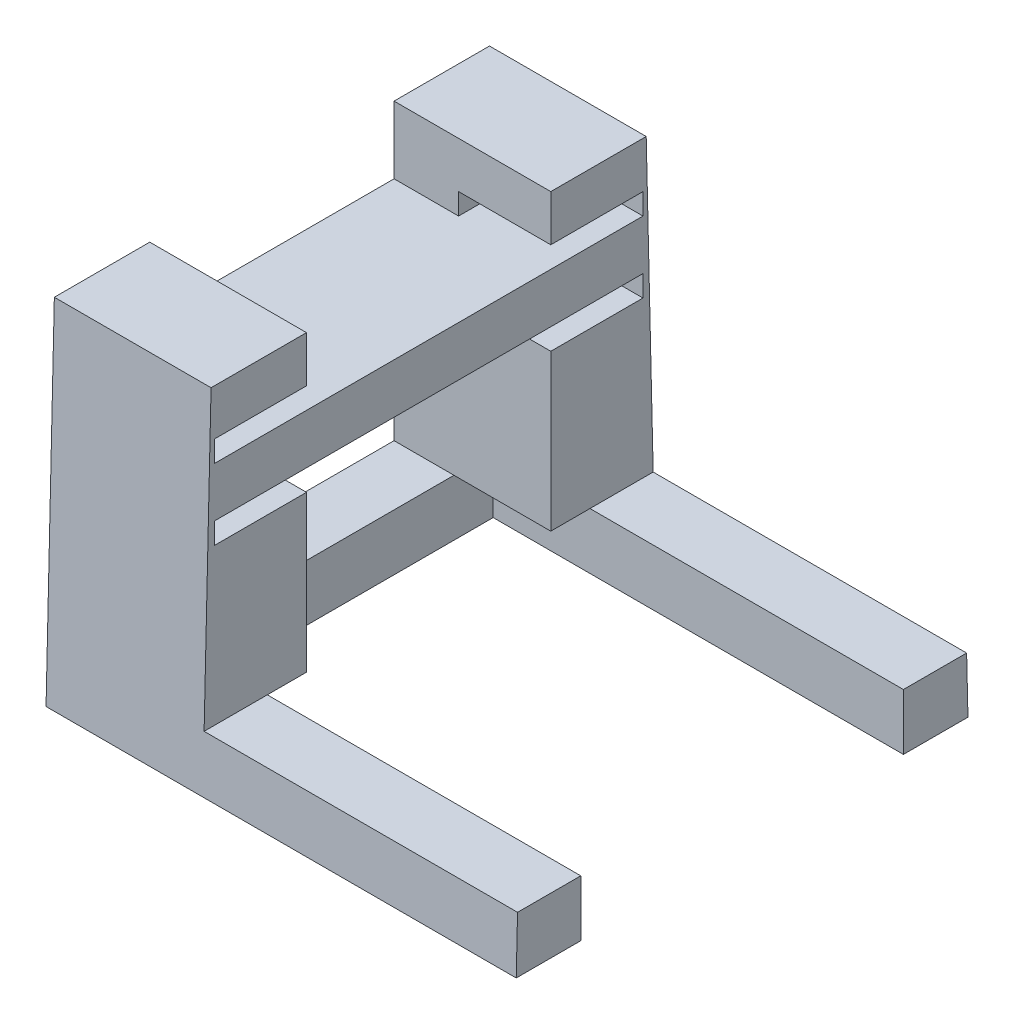
ISO-10303-21;
HEADER;
FILE_DESCRIPTION(('STEP AP214'),'2;1');
FILE_NAME('part.step','',(''),(''),'','','');
FILE_SCHEMA(('AUTOMOTIVE_DESIGN { 1 0 10303 214 1 1 1 1 }'));
ENDSEC;
DATA;
#1=APPLICATION_CONTEXT('core data for automotive mechanical design processes');
#2=APPLICATION_PROTOCOL_DEFINITION('international standard','automotive_design',2000,#1);
#3=PRODUCT_CONTEXT('',#1,'mechanical');
#4=PRODUCT('Part','Part','',(#3));
#5=PRODUCT_RELATED_PRODUCT_CATEGORY('part','',(#4));
#6=PRODUCT_DEFINITION_FORMATION('','',#4);
#7=PRODUCT_DEFINITION_CONTEXT('part definition',#1,'design');
#8=PRODUCT_DEFINITION('design','',#6,#7);
#9=PRODUCT_DEFINITION_SHAPE('','',#8);
#10=(LENGTH_UNIT() NAMED_UNIT(*) SI_UNIT(.MILLI.,.METRE.));
#11=(NAMED_UNIT(*) PLANE_ANGLE_UNIT() SI_UNIT($,.RADIAN.));
#12=(NAMED_UNIT(*) SI_UNIT($,.STERADIAN.) SOLID_ANGLE_UNIT());
#13=UNCERTAINTY_MEASURE_WITH_UNIT(LENGTH_MEASURE(1.E-05),#10,'distance_accuracy_value','');
#14=(GEOMETRIC_REPRESENTATION_CONTEXT(3) GLOBAL_UNCERTAINTY_ASSIGNED_CONTEXT((#13)) GLOBAL_UNIT_ASSIGNED_CONTEXT((#10,
#11,#12)) REPRESENTATION_CONTEXT('',''));
#15=CARTESIAN_POINT('',(0.,0.,0.));
#16=DIRECTION('',(0.,0.,1.));
#17=DIRECTION('',(1.,0.,0.));
#18=AXIS2_PLACEMENT_3D('',#15,#16,#17);
#19=CARTESIAN_POINT('',(17.,0.,0.));
#20=DIRECTION('',(1.,0.,0.));
#21=DIRECTION('',(0.,0.,-1.));
#22=AXIS2_PLACEMENT_3D('',#19,#20,#21);
#23=PLANE('',#22);
#24=DIRECTION('',(0.,0.,1.));
#25=VECTOR('',#24,1.);
#26=CARTESIAN_POINT('',(17.,6.1,0.));
#27=LINE('',#26,#25);
#28=CARTESIAN_POINT('',(17.,6.09999999999999,17.5));
#29=VERTEX_POINT('',#28);
#30=CARTESIAN_POINT('',(17.,6.1,24.3555263157895));
#31=VERTEX_POINT('',#30);
#32=EDGE_CURVE('E257',#29,#31,#27,.T.);
#33=ORIENTED_EDGE('',*,*,#32,.T.);
#34=DIRECTION('',(0.,-0.999719647026643,0.0236775705874732));
#35=VECTOR('',#34,1.);
#36=CARTESIAN_POINT('',(17.,0.,24.5));
#37=LINE('',#36,#35);
#38=CARTESIAN_POINT('',(17.,0.,24.5));
#39=VERTEX_POINT('',#38);
#40=EDGE_CURVE('E256',#31,#39,#37,.T.);
#41=ORIENTED_EDGE('',*,*,#40,.T.);
#42=DIRECTION('',(0.,0.,-1.));
#43=VECTOR('',#42,1.);
#44=CARTESIAN_POINT('',(17.,0.,0.));
#45=LINE('',#44,#43);
#46=CARTESIAN_POINT('',(17.,0.,17.5));
#47=VERTEX_POINT('',#46);
#48=EDGE_CURVE('E298',#39,#47,#45,.T.);
#49=ORIENTED_EDGE('',*,*,#48,.T.);
#50=DIRECTION('',(0.,1.,0.));
#51=VECTOR('',#50,1.);
#52=CARTESIAN_POINT('',(17.,71.2920240520265,17.5));
#53=LINE('',#52,#51);
#54=EDGE_CURVE('E301',#47,#29,#53,.T.);
#55=ORIENTED_EDGE('',*,*,#54,.T.);
#56=EDGE_LOOP('',(#33,#41,#49,#55));
#57=FACE_BOUND('',#56,.T.);
#58=ADVANCED_FACE('F32',(#57),#23,.T.);
#59=DIRECTION('',(0.,0.,1.));
#60=VECTOR('',#59,1.);
#61=CARTESIAN_POINT('',(17.,6.1,0.));
#62=LINE('',#61,#60);
#63=CARTESIAN_POINT('',(17.,6.09999999999999,-24.3555263157895));
#64=VERTEX_POINT('',#63);
#65=CARTESIAN_POINT('',(17.,6.09999999999999,-17.5));
#66=VERTEX_POINT('',#65);
#67=EDGE_CURVE('E253',#64,#66,#62,.T.);
#68=ORIENTED_EDGE('',*,*,#67,.T.);
#69=DIRECTION('',(0.,-1.,0.));
#70=VECTOR('',#69,1.);
#71=CARTESIAN_POINT('',(17.,71.2920240520265,-17.5));
#72=LINE('',#71,#70);
#73=CARTESIAN_POINT('',(17.,0.,-17.5));
#74=VERTEX_POINT('',#73);
#75=EDGE_CURVE('E299',#66,#74,#72,.T.);
#76=ORIENTED_EDGE('',*,*,#75,.T.);
#77=CARTESIAN_POINT('',(17.,0.,-24.5));
#78=VERTEX_POINT('',#77);
#79=EDGE_CURVE('E255',#74,#78,#45,.T.);
#80=ORIENTED_EDGE('',*,*,#79,.T.);
#81=DIRECTION('',(0.,0.999719647026643,0.0236775705874725));
#82=VECTOR('',#81,1.);
#83=CARTESIAN_POINT('',(17.,1.70870262383715E-13,-24.5));
#84=LINE('',#83,#82);
#85=EDGE_CURVE('E240',#78,#64,#84,.T.);
#86=ORIENTED_EDGE('',*,*,#85,.T.);
#87=EDGE_LOOP('',(#68,#76,#80,#86));
#88=FACE_BOUND('',#87,.T.);
#89=ADVANCED_FACE('F251',(#88),#23,.T.);
#90=CARTESIAN_POINT('',(-27.,0.,0.));
#91=DIRECTION('',(1.,0.,0.));
#92=DIRECTION('',(0.,0.,-1.));
#93=AXIS2_PLACEMENT_3D('',#90,#91,#92);
#94=PLANE('',#93);
#95=DIRECTION('',(0.,0.,1.));
#96=VECTOR('',#95,1.);
#97=CARTESIAN_POINT('',(-27.,30.7,0.));
#98=LINE('',#97,#96);
#99=CARTESIAN_POINT('',(-27.,30.7,-23.25));
#100=VERTEX_POINT('',#99);
#101=CARTESIAN_POINT('',(-27.,30.7,-13.25));
#102=VERTEX_POINT('',#101);
#103=EDGE_CURVE('E447',#100,#102,#98,.T.);
#104=ORIENTED_EDGE('',*,*,#103,.F.);
#105=DIRECTION('',(0.,-1.,0.));
#106=VECTOR('',#105,1.);
#107=CARTESIAN_POINT('',(-27.,23.,-23.25));
#108=LINE('',#107,#106);
#109=CARTESIAN_POINT('',(-27.,33.,-23.25));
#110=VERTEX_POINT('',#109);
#111=EDGE_CURVE('E406',#110,#100,#108,.T.);
#112=ORIENTED_EDGE('',*,*,#111,.F.);
#113=DIRECTION('',(0.,0.,-1.));
#114=VECTOR('',#113,1.);
#115=CARTESIAN_POINT('',(-27.,33.,-23.25));
#116=LINE('',#115,#114);
#117=CARTESIAN_POINT('',(-27.,33.,-13.25));
#118=VERTEX_POINT('',#117);
#119=EDGE_CURVE('E408',#118,#110,#116,.T.);
#120=ORIENTED_EDGE('',*,*,#119,.F.);
#121=DIRECTION('',(0.,-1.,0.));
#122=VECTOR('',#121,1.);
#123=CARTESIAN_POINT('',(-27.,0.,-13.25));
#124=LINE('',#123,#122);
#125=EDGE_CURVE('E411',#118,#102,#124,.T.);
#126=ORIENTED_EDGE('',*,*,#125,.T.);
#127=EDGE_LOOP('',(#104,#112,#120,#126));
#128=FACE_BOUND('',#127,.T.);
#129=ADVANCED_FACE('F541',(#128),#94,.T.);
#130=CARTESIAN_POINT('',(-27.,0.,0.));
#131=DIRECTION('',(1.,0.,0.));
#132=DIRECTION('',(0.,0.,-1.));
#133=AXIS2_PLACEMENT_3D('',#130,#131,#132);
#134=PLANE('',#133);
#135=DIRECTION('',(0.,0.,1.));
#136=VECTOR('',#135,1.);
#137=CARTESIAN_POINT('',(-27.,30.7,0.));
#138=LINE('',#137,#136);
#139=CARTESIAN_POINT('',(-27.,30.7,13.25));
#140=VERTEX_POINT('',#139);
#141=CARTESIAN_POINT('',(-27.,30.7,23.25));
#142=VERTEX_POINT('',#141);
#143=EDGE_CURVE('E440',#140,#142,#138,.T.);
#144=ORIENTED_EDGE('',*,*,#143,.F.);
#145=DIRECTION('',(0.,1.,0.));
#146=VECTOR('',#145,1.);
#147=CARTESIAN_POINT('',(-27.,0.,13.25));
#148=LINE('',#147,#146);
#149=CARTESIAN_POINT('',(-27.,33.,13.25));
#150=VERTEX_POINT('',#149);
#151=EDGE_CURVE('E400',#140,#150,#148,.T.);
#152=ORIENTED_EDGE('',*,*,#151,.T.);
#153=DIRECTION('',(0.,0.,-1.));
#154=VECTOR('',#153,1.);
#155=CARTESIAN_POINT('',(-27.,33.,-23.25));
#156=LINE('',#155,#154);
#157=CARTESIAN_POINT('',(-27.,33.,23.25));
#158=VERTEX_POINT('',#157);
#159=EDGE_CURVE('E377',#158,#150,#156,.T.);
#160=ORIENTED_EDGE('',*,*,#159,.F.);
#161=DIRECTION('',(0.,1.,0.));
#162=VECTOR('',#161,1.);
#163=CARTESIAN_POINT('',(-27.,23.,23.25));
#164=LINE('',#163,#162);
#165=EDGE_CURVE('E373',#142,#158,#164,.T.);
#166=ORIENTED_EDGE('',*,*,#165,.F.);
#167=EDGE_LOOP('',(#144,#152,#160,#166));
#168=FACE_BOUND('',#167,.T.);
#169=ADVANCED_FACE('F543',(#168),#134,.T.);
#170=DIRECTION('',(0.,0.,-1.));
#171=VECTOR('',#170,1.);
#172=CARTESIAN_POINT('',(-27.,25.3,0.));
#173=LINE('',#172,#171);
#174=CARTESIAN_POINT('',(-27.,25.3,-13.25));
#175=VERTEX_POINT('',#174);
#176=CARTESIAN_POINT('',(-27.,25.3,-23.25));
#177=VERTEX_POINT('',#176);
#178=EDGE_CURVE('E458',#175,#177,#173,.T.);
#179=ORIENTED_EDGE('',*,*,#178,.F.);
#180=CARTESIAN_POINT('',(-27.,23.,-13.25));
#181=VERTEX_POINT('',#180);
#182=EDGE_CURVE('E435',#175,#181,#124,.T.);
#183=ORIENTED_EDGE('',*,*,#182,.T.);
#184=DIRECTION('',(0.,0.,1.));
#185=VECTOR('',#184,1.);
#186=CARTESIAN_POINT('',(-27.,23.,-23.25));
#187=LINE('',#186,#185);
#188=CARTESIAN_POINT('',(-27.,23.,-23.25));
#189=VERTEX_POINT('',#188);
#190=EDGE_CURVE('E403',#189,#181,#187,.T.);
#191=ORIENTED_EDGE('',*,*,#190,.F.);
#192=EDGE_CURVE('E412',#177,#189,#108,.T.);
#193=ORIENTED_EDGE('',*,*,#192,.F.);
#194=EDGE_LOOP('',(#179,#183,#191,#193));
#195=FACE_BOUND('',#194,.T.);
#196=ADVANCED_FACE('F546',(#195),#94,.T.);
#197=DIRECTION('',(0.,0.,-1.));
#198=VECTOR('',#197,1.);
#199=CARTESIAN_POINT('',(-27.,25.3,0.));
#200=LINE('',#199,#198);
#201=CARTESIAN_POINT('',(-27.,25.3,23.25));
#202=VERTEX_POINT('',#201);
#203=CARTESIAN_POINT('',(-27.,25.3,13.25));
#204=VERTEX_POINT('',#203);
#205=EDGE_CURVE('E451',#202,#204,#200,.T.);
#206=ORIENTED_EDGE('',*,*,#205,.F.);
#207=CARTESIAN_POINT('',(-27.,23.,23.25));
#208=VERTEX_POINT('',#207);
#209=EDGE_CURVE('E389',#208,#202,#164,.T.);
#210=ORIENTED_EDGE('',*,*,#209,.F.);
#211=DIRECTION('',(0.,0.,1.));
#212=VECTOR('',#211,1.);
#213=CARTESIAN_POINT('',(-27.,23.,-23.25));
#214=LINE('',#213,#212);
#215=CARTESIAN_POINT('',(-27.,23.,13.25));
#216=VERTEX_POINT('',#215);
#217=EDGE_CURVE('E369',#216,#208,#214,.T.);
#218=ORIENTED_EDGE('',*,*,#217,.F.);
#219=EDGE_CURVE('E372',#216,#204,#148,.T.);
#220=ORIENTED_EDGE('',*,*,#219,.T.);
#221=EDGE_LOOP('',(#206,#210,#218,#220));
#222=FACE_BOUND('',#221,.T.);
#223=ADVANCED_FACE('F553',(#222),#134,.T.);
#224=CARTESIAN_POINT('',(34.001,23.,-23.25));
#225=DIRECTION('',(0.,-1.,0.));
#226=DIRECTION('',(0.,0.,-1.));
#227=AXIS2_PLACEMENT_3D('',#224,#225,#226);
#228=PLANE('',#227);
#229=DIRECTION('',(0.,0.,1.));
#230=VECTOR('',#229,1.);
#231=CARTESIAN_POINT('',(-17.,23.,-23.25));
#232=LINE('',#231,#230);
#233=CARTESIAN_POINT('',(-17.,23.,-23.25));
#234=VERTEX_POINT('',#233);
#235=CARTESIAN_POINT('',(-17.,23.,-13.25));
#236=VERTEX_POINT('',#235);
#237=EDGE_CURVE('E407',#234,#236,#232,.T.);
#238=ORIENTED_EDGE('',*,*,#237,.F.);
#239=DIRECTION('',(-1.,0.,0.));
#240=VECTOR('',#239,1.);
#241=CARTESIAN_POINT('',(34.001,23.,-23.25));
#242=LINE('',#241,#240);
#243=EDGE_CURVE('E413',#234,#189,#242,.T.);
#244=ORIENTED_EDGE('',*,*,#243,.T.);
#245=ORIENTED_EDGE('',*,*,#190,.T.);
#246=DIRECTION('',(-1.,0.,0.));
#247=VECTOR('',#246,1.);
#248=CARTESIAN_POINT('',(34.001,23.,-13.25));
#249=LINE('',#248,#247);
#250=EDGE_CURVE('E421',#236,#181,#249,.T.);
#251=ORIENTED_EDGE('',*,*,#250,.F.);
#252=EDGE_LOOP('',(#238,#244,#245,#251));
#253=FACE_BOUND('',#252,.T.);
#254=ADVANCED_FACE('F562',(#253),#228,.F.);
#255=CARTESIAN_POINT('',(34.001,23.,-23.25));
#256=DIRECTION('',(0.,0.,-1.));
#257=DIRECTION('',(-1.,0.,0.));
#258=AXIS2_PLACEMENT_3D('',#255,#256,#257);
#259=PLANE('',#258);
#260=DIRECTION('',(0.,-1.,0.));
#261=VECTOR('',#260,1.);
#262=CARTESIAN_POINT('',(-17.,23.,-23.25));
#263=LINE('',#262,#261);
#264=CARTESIAN_POINT('',(-17.,25.3,-23.25));
#265=VERTEX_POINT('',#264);
#266=EDGE_CURVE('E420',#265,#234,#263,.T.);
#267=ORIENTED_EDGE('',*,*,#266,.F.);
#268=DIRECTION('',(-1.,0.,0.));
#269=VECTOR('',#268,1.);
#270=CARTESIAN_POINT('',(34.001,25.3,-23.25));
#271=LINE('',#270,#269);
#272=EDGE_CURVE('E322',#265,#177,#271,.T.);
#273=ORIENTED_EDGE('',*,*,#272,.T.);
#274=ORIENTED_EDGE('',*,*,#192,.T.);
#275=ORIENTED_EDGE('',*,*,#243,.F.);
#276=EDGE_LOOP('',(#267,#273,#274,#275));
#277=FACE_BOUND('',#276,.T.);
#278=ADVANCED_FACE('F583',(#277),#259,.F.);
#279=CARTESIAN_POINT('',(34.001,23.,23.25));
#280=DIRECTION('',(0.,0.,1.));
#281=DIRECTION('',(1.,0.,0.));
#282=AXIS2_PLACEMENT_3D('',#279,#280,#281);
#283=PLANE('',#282);
#284=ORIENTED_EDGE('',*,*,#209,.T.);
#285=DIRECTION('',(1.,0.,0.));
#286=VECTOR('',#285,1.);
#287=CARTESIAN_POINT('',(34.001,25.3,23.25));
#288=LINE('',#287,#286);
#289=CARTESIAN_POINT('',(-17.,25.3,23.25));
#290=VERTEX_POINT('',#289);
#291=EDGE_CURVE('E453',#202,#290,#288,.T.);
#292=ORIENTED_EDGE('',*,*,#291,.T.);
#293=DIRECTION('',(0.,1.,0.));
#294=VECTOR('',#293,1.);
#295=CARTESIAN_POINT('',(-17.,23.,23.25));
#296=LINE('',#295,#294);
#297=CARTESIAN_POINT('',(-17.,23.,23.25));
#298=VERTEX_POINT('',#297);
#299=EDGE_CURVE('E382',#298,#290,#296,.T.);
#300=ORIENTED_EDGE('',*,*,#299,.F.);
#301=DIRECTION('',(-1.,0.,0.));
#302=VECTOR('',#301,1.);
#303=CARTESIAN_POINT('',(34.001,23.,23.25));
#304=LINE('',#303,#302);
#305=EDGE_CURVE('E396',#298,#208,#304,.T.);
#306=ORIENTED_EDGE('',*,*,#305,.T.);
#307=EDGE_LOOP('',(#284,#292,#300,#306));
#308=FACE_BOUND('',#307,.T.);
#309=ADVANCED_FACE('F578',(#308),#283,.F.);
#310=CARTESIAN_POINT('',(34.001,23.,-23.25));
#311=DIRECTION('',(0.,-1.,0.));
#312=DIRECTION('',(0.,0.,-1.));
#313=AXIS2_PLACEMENT_3D('',#310,#311,#312);
#314=PLANE('',#313);
#315=DIRECTION('',(1.,0.,0.));
#316=VECTOR('',#315,1.);
#317=CARTESIAN_POINT('',(34.001,23.,13.25));
#318=LINE('',#317,#316);
#319=CARTESIAN_POINT('',(-17.,23.,13.25));
#320=VERTEX_POINT('',#319);
#321=EDGE_CURVE('E374',#216,#320,#318,.T.);
#322=ORIENTED_EDGE('',*,*,#321,.F.);
#323=ORIENTED_EDGE('',*,*,#217,.T.);
#324=ORIENTED_EDGE('',*,*,#305,.F.);
#325=DIRECTION('',(0.,0.,1.));
#326=VECTOR('',#325,1.);
#327=CARTESIAN_POINT('',(-17.,23.,-23.25));
#328=LINE('',#327,#326);
#329=EDGE_CURVE('E378',#320,#298,#328,.T.);
#330=ORIENTED_EDGE('',*,*,#329,.F.);
#331=EDGE_LOOP('',(#322,#323,#324,#330));
#332=FACE_BOUND('',#331,.T.);
#333=ADVANCED_FACE('F575',(#332),#314,.F.);
#334=CARTESIAN_POINT('',(34.001,33.,-23.25));
#335=DIRECTION('',(0.,1.,0.));
#336=DIRECTION('',(0.,0.,1.));
#337=AXIS2_PLACEMENT_3D('',#334,#335,#336);
#338=PLANE('',#337);
#339=DIRECTION('',(-1.,0.,0.));
#340=VECTOR('',#339,1.);
#341=CARTESIAN_POINT('',(34.001,33.,23.25));
#342=LINE('',#341,#340);
#343=CARTESIAN_POINT('',(-17.,33.,23.25));
#344=VERTEX_POINT('',#343);
#345=EDGE_CURVE('E386',#344,#158,#342,.T.);
#346=ORIENTED_EDGE('',*,*,#345,.T.);
#347=ORIENTED_EDGE('',*,*,#159,.T.);
#348=DIRECTION('',(-1.,0.,0.));
#349=VECTOR('',#348,1.);
#350=CARTESIAN_POINT('',(34.001,33.,13.25));
#351=LINE('',#350,#349);
#352=CARTESIAN_POINT('',(-17.,33.,13.25));
#353=VERTEX_POINT('',#352);
#354=EDGE_CURVE('E368',#353,#150,#351,.T.);
#355=ORIENTED_EDGE('',*,*,#354,.F.);
#356=DIRECTION('',(0.,0.,-1.));
#357=VECTOR('',#356,1.);
#358=CARTESIAN_POINT('',(-17.,33.,-23.25));
#359=LINE('',#358,#357);
#360=EDGE_CURVE('E381',#344,#353,#359,.T.);
#361=ORIENTED_EDGE('',*,*,#360,.F.);
#362=EDGE_LOOP('',(#346,#347,#355,#361));
#363=FACE_BOUND('',#362,.T.);
#364=ADVANCED_FACE('F600',(#363),#338,.F.);
#365=CARTESIAN_POINT('',(-17.,30.7,23.25));
#366=VERTEX_POINT('',#365);
#367=EDGE_CURVE('E385',#366,#344,#296,.T.);
#368=ORIENTED_EDGE('',*,*,#367,.F.);
#369=DIRECTION('',(-1.,0.,0.));
#370=VECTOR('',#369,1.);
#371=CARTESIAN_POINT('',(34.001,30.7,23.25));
#372=LINE('',#371,#370);
#373=EDGE_CURVE('E442',#366,#142,#372,.T.);
#374=ORIENTED_EDGE('',*,*,#373,.T.);
#375=ORIENTED_EDGE('',*,*,#165,.T.);
#376=ORIENTED_EDGE('',*,*,#345,.F.);
#377=EDGE_LOOP('',(#368,#374,#375,#376));
#378=FACE_BOUND('',#377,.T.);
#379=ADVANCED_FACE('F598',(#378),#283,.F.);
#380=ORIENTED_EDGE('',*,*,#111,.T.);
#381=DIRECTION('',(1.,0.,0.));
#382=VECTOR('',#381,1.);
#383=CARTESIAN_POINT('',(34.001,30.7,-23.25));
#384=LINE('',#383,#382);
#385=CARTESIAN_POINT('',(-17.,30.7,-23.25));
#386=VERTEX_POINT('',#385);
#387=EDGE_CURVE('E866',#100,#386,#384,.T.);
#388=ORIENTED_EDGE('',*,*,#387,.T.);
#389=CARTESIAN_POINT('',(-17.,33.,-23.25));
#390=VERTEX_POINT('',#389);
#391=EDGE_CURVE('E416',#390,#386,#263,.T.);
#392=ORIENTED_EDGE('',*,*,#391,.F.);
#393=DIRECTION('',(-1.,0.,0.));
#394=VECTOR('',#393,1.);
#395=CARTESIAN_POINT('',(34.001,33.,-23.25));
#396=LINE('',#395,#394);
#397=EDGE_CURVE('E417',#390,#110,#396,.T.);
#398=ORIENTED_EDGE('',*,*,#397,.T.);
#399=EDGE_LOOP('',(#380,#388,#392,#398));
#400=FACE_BOUND('',#399,.T.);
#401=ADVANCED_FACE('F589',(#400),#259,.F.);
#402=CARTESIAN_POINT('',(34.001,33.,-23.25));
#403=DIRECTION('',(0.,1.,0.));
#404=DIRECTION('',(0.,0.,1.));
#405=AXIS2_PLACEMENT_3D('',#402,#403,#404);
#406=PLANE('',#405);
#407=ORIENTED_EDGE('',*,*,#119,.T.);
#408=ORIENTED_EDGE('',*,*,#397,.F.);
#409=DIRECTION('',(0.,0.,-1.));
#410=VECTOR('',#409,1.);
#411=CARTESIAN_POINT('',(-17.,33.,-23.25));
#412=LINE('',#411,#410);
#413=CARTESIAN_POINT('',(-17.,33.,-13.25));
#414=VERTEX_POINT('',#413);
#415=EDGE_CURVE('E419',#414,#390,#412,.T.);
#416=ORIENTED_EDGE('',*,*,#415,.F.);
#417=DIRECTION('',(1.,0.,0.));
#418=VECTOR('',#417,1.);
#419=CARTESIAN_POINT('',(34.001,33.,-13.25));
#420=LINE('',#419,#418);
#421=EDGE_CURVE('E424',#118,#414,#420,.T.);
#422=ORIENTED_EDGE('',*,*,#421,.F.);
#423=EDGE_LOOP('',(#407,#408,#416,#422));
#424=FACE_BOUND('',#423,.T.);
#425=ADVANCED_FACE('F591',(#424),#406,.F.);
#426=CARTESIAN_POINT('',(-34.,38.,-13.25));
#427=DIRECTION('',(0.,0.,1.));
#428=DIRECTION('',(1.,0.,0.));
#429=AXIS2_PLACEMENT_3D('',#426,#427,#428);
#430=PLANE('',#429);
#431=DIRECTION('',(-1.,0.,0.));
#432=VECTOR('',#431,1.);
#433=CARTESIAN_POINT('',(-34.,30.7,-13.25));
#434=LINE('',#433,#432);
#435=CARTESIAN_POINT('',(-34.,30.7,-13.25));
#436=VERTEX_POINT('',#435);
#437=EDGE_CURVE('E445',#102,#436,#434,.T.);
#438=ORIENTED_EDGE('',*,*,#437,.F.);
#439=ORIENTED_EDGE('',*,*,#125,.F.);
#440=ORIENTED_EDGE('',*,*,#421,.T.);
#441=DIRECTION('',(0.,-1.,0.));
#442=VECTOR('',#441,1.);
#443=CARTESIAN_POINT('',(-17.,38.,-13.25));
#444=LINE('',#443,#442);
#445=CARTESIAN_POINT('',(-17.,38.,-13.25));
#446=VERTEX_POINT('',#445);
#447=EDGE_CURVE('E352',#446,#414,#444,.T.);
#448=ORIENTED_EDGE('',*,*,#447,.F.);
#449=DIRECTION('',(-1.,0.,0.));
#450=VECTOR('',#449,1.);
#451=CARTESIAN_POINT('',(-34.,38.,-13.25));
#452=LINE('',#451,#450);
#453=CARTESIAN_POINT('',(-34.,38.,-13.25));
#454=VERTEX_POINT('',#453);
#455=EDGE_CURVE('E360',#446,#454,#452,.T.);
#456=ORIENTED_EDGE('',*,*,#455,.T.);
#457=DIRECTION('',(0.,-1.,0.));
#458=VECTOR('',#457,1.);
#459=CARTESIAN_POINT('',(-34.,38.,-13.25));
#460=LINE('',#459,#458);
#461=EDGE_CURVE('E357',#454,#436,#460,.T.);
#462=ORIENTED_EDGE('',*,*,#461,.T.);
#463=EDGE_LOOP('',(#438,#439,#440,#448,#456,#462));
#464=FACE_BOUND('',#463,.T.);
#465=ADVANCED_FACE('F594',(#464),#430,.T.);
#466=CARTESIAN_POINT('',(32.2966530304036,30.7,24.5));
#467=DIRECTION('',(0.,1.,0.));
#468=DIRECTION('',(0.,0.,1.));
#469=AXIS2_PLACEMENT_3D('',#466,#467,#468);
#470=PLANE('',#469);
#471=DIRECTION('',(0.,0.,-1.));
#472=VECTOR('',#471,1.);
#473=CARTESIAN_POINT('',(-34.,30.7,24.5));
#474=LINE('',#473,#472);
#475=CARTESIAN_POINT('',(-34.,30.7,13.25));
#476=VERTEX_POINT('',#475);
#477=EDGE_CURVE('E465',#476,#436,#474,.T.);
#478=ORIENTED_EDGE('',*,*,#477,.F.);
#479=DIRECTION('',(1.,0.,0.));
#480=VECTOR('',#479,1.);
#481=CARTESIAN_POINT('',(-34.,30.7,13.25));
#482=LINE('',#481,#480);
#483=EDGE_CURVE('E438',#476,#140,#482,.T.);
#484=ORIENTED_EDGE('',*,*,#483,.T.);
#485=ORIENTED_EDGE('',*,*,#143,.T.);
#486=ORIENTED_EDGE('',*,*,#373,.F.);
#487=DIRECTION('',(0.,0.,-1.));
#488=VECTOR('',#487,1.);
#489=CARTESIAN_POINT('',(-17.,30.7,24.5));
#490=LINE('',#489,#488);
#491=EDGE_CURVE('E462',#366,#386,#490,.T.);
#492=ORIENTED_EDGE('',*,*,#491,.T.);
#493=ORIENTED_EDGE('',*,*,#387,.F.);
#494=ORIENTED_EDGE('',*,*,#103,.T.);
#495=ORIENTED_EDGE('',*,*,#437,.T.);
#496=EDGE_LOOP('',(#478,#484,#485,#486,#492,#493,#494,#495));
#497=FACE_BOUND('',#496,.T.);
#498=ADVANCED_FACE('F758',(#497),#470,.T.);
#499=CARTESIAN_POINT('',(-34.,38.,13.25));
#500=DIRECTION('',(0.,0.,-1.));
#501=DIRECTION('',(-1.,0.,0.));
#502=AXIS2_PLACEMENT_3D('',#499,#500,#501);
#503=PLANE('',#502);
#504=ORIENTED_EDGE('',*,*,#483,.F.);
#505=DIRECTION('',(0.,-1.,0.));
#506=VECTOR('',#505,1.);
#507=CARTESIAN_POINT('',(-34.,38.,13.25));
#508=LINE('',#507,#506);
#509=CARTESIAN_POINT('',(-34.,38.,13.25));
#510=VERTEX_POINT('',#509);
#511=EDGE_CURVE('E329',#510,#476,#508,.T.);
#512=ORIENTED_EDGE('',*,*,#511,.F.);
#513=DIRECTION('',(1.,0.,0.));
#514=VECTOR('',#513,1.);
#515=CARTESIAN_POINT('',(-34.,38.,13.25));
#516=LINE('',#515,#514);
#517=CARTESIAN_POINT('',(-17.,38.,13.25));
#518=VERTEX_POINT('',#517);
#519=EDGE_CURVE('E340',#510,#518,#516,.T.);
#520=ORIENTED_EDGE('',*,*,#519,.T.);
#521=DIRECTION('',(0.,-1.,0.));
#522=VECTOR('',#521,1.);
#523=CARTESIAN_POINT('',(-17.,38.,13.25));
#524=LINE('',#523,#522);
#525=EDGE_CURVE('E334',#518,#353,#524,.T.);
#526=ORIENTED_EDGE('',*,*,#525,.T.);
#527=ORIENTED_EDGE('',*,*,#354,.T.);
#528=ORIENTED_EDGE('',*,*,#151,.F.);
#529=EDGE_LOOP('',(#504,#512,#520,#526,#527,#528));
#530=FACE_BOUND('',#529,.T.);
#531=ADVANCED_FACE('F610',(#530),#503,.T.);
#532=DIRECTION('',(1.,0.,0.));
#533=VECTOR('',#532,1.);
#534=CARTESIAN_POINT('',(-34.,25.3,-13.25));
#535=LINE('',#534,#533);
#536=CARTESIAN_POINT('',(-34.,25.3,-13.25));
#537=VERTEX_POINT('',#536);
#538=EDGE_CURVE('E456',#537,#175,#535,.T.);
#539=ORIENTED_EDGE('',*,*,#538,.F.);
#540=CARTESIAN_POINT('',(-34.,6.1,-13.25));
#541=VERTEX_POINT('',#540);
#542=EDGE_CURVE('E356',#537,#541,#460,.T.);
#543=ORIENTED_EDGE('',*,*,#542,.T.);
#544=DIRECTION('',(1.,0.,0.));
#545=VECTOR('',#544,1.);
#546=CARTESIAN_POINT('',(0.,6.1,-13.25));
#547=LINE('',#546,#545);
#548=CARTESIAN_POINT('',(-27.5,6.09999999999999,-13.25));
#549=VERTEX_POINT('',#548);
#550=EDGE_CURVE('E345',#541,#549,#547,.T.);
#551=ORIENTED_EDGE('',*,*,#550,.T.);
#552=DIRECTION('',(-1.,0.,0.));
#553=VECTOR('',#552,1.);
#554=CARTESIAN_POINT('',(-34.,6.1,-13.25));
#555=LINE('',#554,#553);
#556=CARTESIAN_POINT('',(-17.,6.1,-13.25));
#557=VERTEX_POINT('',#556);
#558=EDGE_CURVE('E473',#557,#549,#555,.T.);
#559=ORIENTED_EDGE('',*,*,#558,.F.);
#560=EDGE_CURVE('E355',#236,#557,#444,.T.);
#561=ORIENTED_EDGE('',*,*,#560,.F.);
#562=ORIENTED_EDGE('',*,*,#250,.T.);
#563=ORIENTED_EDGE('',*,*,#182,.F.);
#564=EDGE_LOOP('',(#539,#543,#551,#559,#561,#562,#563));
#565=FACE_BOUND('',#564,.T.);
#566=ADVANCED_FACE('F526',(#565),#430,.T.);
#567=CARTESIAN_POINT('',(0.,6.1,0.));
#568=DIRECTION('',(0.,1.,0.));
#569=DIRECTION('',(0.,0.,1.));
#570=AXIS2_PLACEMENT_3D('',#567,#568,#569);
#571=PLANE('',#570);
#572=DIRECTION('',(0.,0.,-1.));
#573=VECTOR('',#572,1.);
#574=CARTESIAN_POINT('',(-27.5,6.09999999999999,-17.5));
#575=LINE('',#574,#573);
#576=CARTESIAN_POINT('',(-27.5,6.09999999999999,13.25));
#577=VERTEX_POINT('',#576);
#578=EDGE_CURVE('E481',#577,#549,#575,.T.);
#579=ORIENTED_EDGE('',*,*,#578,.T.);
#580=ORIENTED_EDGE('',*,*,#550,.F.);
#581=DIRECTION('',(0.,0.,1.));
#582=VECTOR('',#581,1.);
#583=CARTESIAN_POINT('',(-34.,6.1,24.5));
#584=LINE('',#583,#582);
#585=CARTESIAN_POINT('',(-34.,6.1,13.25));
#586=VERTEX_POINT('',#585);
#587=EDGE_CURVE('E307',#541,#586,#584,.T.);
#588=ORIENTED_EDGE('',*,*,#587,.T.);
#589=DIRECTION('',(-1.,0.,0.));
#590=VECTOR('',#589,1.);
#591=CARTESIAN_POINT('',(0.,6.1,13.25));
#592=LINE('',#591,#590);
#593=EDGE_CURVE('E328',#577,#586,#592,.T.);
#594=ORIENTED_EDGE('',*,*,#593,.F.);
#595=EDGE_LOOP('',(#579,#580,#588,#594));
#596=FACE_BOUND('',#595,.T.);
#597=ADVANCED_FACE('F493',(#596),#571,.T.);
#598=DIRECTION('',(-1.,0.,0.));
#599=VECTOR('',#598,1.);
#600=CARTESIAN_POINT('',(-34.,25.3,13.25));
#601=LINE('',#600,#599);
#602=CARTESIAN_POINT('',(-34.,25.3,13.25));
#603=VERTEX_POINT('',#602);
#604=EDGE_CURVE('E449',#204,#603,#601,.T.);
#605=ORIENTED_EDGE('',*,*,#604,.F.);
#606=ORIENTED_EDGE('',*,*,#219,.F.);
#607=ORIENTED_EDGE('',*,*,#321,.T.);
#608=CARTESIAN_POINT('',(-17.,6.1,13.25));
#609=VERTEX_POINT('',#608);
#610=EDGE_CURVE('E333',#320,#609,#524,.T.);
#611=ORIENTED_EDGE('',*,*,#610,.T.);
#612=EDGE_CURVE('E318',#609,#577,#592,.T.);
#613=ORIENTED_EDGE('',*,*,#612,.T.);
#614=ORIENTED_EDGE('',*,*,#593,.T.);
#615=EDGE_CURVE('E332',#603,#586,#508,.T.);
#616=ORIENTED_EDGE('',*,*,#615,.F.);
#617=EDGE_LOOP('',(#605,#606,#607,#611,#613,#614,#616));
#618=FACE_BOUND('',#617,.T.);
#619=ADVANCED_FACE('F501',(#618),#503,.T.);
#620=CARTESIAN_POINT('',(32.2966530304036,25.3,24.5));
#621=DIRECTION('',(0.,-1.,0.));
#622=DIRECTION('',(0.,0.,-1.));
#623=AXIS2_PLACEMENT_3D('',#620,#621,#622);
#624=PLANE('',#623);
#625=ORIENTED_EDGE('',*,*,#205,.T.);
#626=ORIENTED_EDGE('',*,*,#604,.T.);
#627=DIRECTION('',(0.,0.,1.));
#628=VECTOR('',#627,1.);
#629=CARTESIAN_POINT('',(-34.,25.3,24.5));
#630=LINE('',#629,#628);
#631=EDGE_CURVE('E464',#537,#603,#630,.T.);
#632=ORIENTED_EDGE('',*,*,#631,.F.);
#633=ORIENTED_EDGE('',*,*,#538,.T.);
#634=ORIENTED_EDGE('',*,*,#178,.T.);
#635=ORIENTED_EDGE('',*,*,#272,.F.);
#636=DIRECTION('',(0.,0.,1.));
#637=VECTOR('',#636,1.);
#638=CARTESIAN_POINT('',(-17.,25.3,24.5));
#639=LINE('',#638,#637);
#640=EDGE_CURVE('E460',#265,#290,#639,.T.);
#641=ORIENTED_EDGE('',*,*,#640,.T.);
#642=ORIENTED_EDGE('',*,*,#291,.F.);
#643=EDGE_LOOP('',(#625,#626,#632,#633,#634,#635,#641,#642));
#644=FACE_BOUND('',#643,.T.);
#645=ADVANCED_FACE('F616',(#644),#624,.T.);
#646=CARTESIAN_POINT('',(0.,6.1,0.));
#647=DIRECTION('',(0.,1.,0.));
#648=DIRECTION('',(0.,0.,1.));
#649=AXIS2_PLACEMENT_3D('',#646,#647,#648);
#650=PLANE('',#649);
#651=DIRECTION('',(0.,0.,-1.));
#652=VECTOR('',#651,1.);
#653=CARTESIAN_POINT('',(-17.,6.1,0.));
#654=LINE('',#653,#652);
#655=CARTESIAN_POINT('',(-17.,6.09999999999999,-17.5));
#656=VERTEX_POINT('',#655);
#657=EDGE_CURVE('E348',#557,#656,#654,.T.);
#658=ORIENTED_EDGE('',*,*,#657,.F.);
#659=ORIENTED_EDGE('',*,*,#558,.T.);
#660=CARTESIAN_POINT('',(-27.5,6.09999999999999,-17.5));
#661=VERTEX_POINT('',#660);
#662=EDGE_CURVE('E477',#549,#661,#575,.T.);
#663=ORIENTED_EDGE('',*,*,#662,.T.);
#664=DIRECTION('',(1.,0.,0.));
#665=VECTOR('',#664,1.);
#666=CARTESIAN_POINT('',(27.5,6.09999999999999,-17.5));
#667=LINE('',#666,#665);
#668=EDGE_CURVE('E269',#661,#656,#667,.T.);
#669=ORIENTED_EDGE('',*,*,#668,.T.);
#670=EDGE_LOOP('',(#658,#659,#663,#669));
#671=FACE_BOUND('',#670,.T.);
#672=ADVANCED_FACE('F519',(#671),#650,.F.);
#673=DIRECTION('',(0.,0.,1.));
#674=VECTOR('',#673,1.);
#675=CARTESIAN_POINT('',(-17.,6.1,24.5));
#676=LINE('',#675,#674);
#677=CARTESIAN_POINT('',(-17.,6.09999999999999,17.5));
#678=VERTEX_POINT('',#677);
#679=EDGE_CURVE('E468',#609,#678,#676,.T.);
#680=ORIENTED_EDGE('',*,*,#679,.T.);
#681=DIRECTION('',(-1.,0.,0.));
#682=VECTOR('',#681,1.);
#683=CARTESIAN_POINT('',(27.5,6.09999999999999,17.5));
#684=LINE('',#683,#682);
#685=CARTESIAN_POINT('',(-27.5,6.09999999999999,17.5));
#686=VERTEX_POINT('',#685);
#687=EDGE_CURVE('E267',#678,#686,#684,.T.);
#688=ORIENTED_EDGE('',*,*,#687,.T.);
#689=EDGE_CURVE('E288',#686,#577,#575,.T.);
#690=ORIENTED_EDGE('',*,*,#689,.T.);
#691=ORIENTED_EDGE('',*,*,#612,.F.);
#692=EDGE_LOOP('',(#680,#688,#690,#691));
#693=FACE_BOUND('',#692,.T.);
#694=ADVANCED_FACE('F489',(#693),#650,.F.);
#695=CARTESIAN_POINT('',(-27.5,71.2920240520265,-17.5));
#696=DIRECTION('',(-1.,0.,0.));
#697=DIRECTION('',(0.,0.,1.));
#698=AXIS2_PLACEMENT_3D('',#695,#696,#697);
#699=PLANE('',#698);
#700=DIRECTION('',(0.,-1.,0.));
#701=VECTOR('',#700,1.);
#702=CARTESIAN_POINT('',(-27.5,71.2920240520265,17.5));
#703=LINE('',#702,#701);
#704=CARTESIAN_POINT('',(-27.5,0.,17.5));
#705=VERTEX_POINT('',#704);
#706=EDGE_CURVE('E476',#686,#705,#703,.T.);
#707=ORIENTED_EDGE('',*,*,#706,.T.);
#708=DIRECTION('',(0.,0.,-1.));
#709=VECTOR('',#708,1.);
#710=CARTESIAN_POINT('',(-27.5,0.,-17.5));
#711=LINE('',#710,#709);
#712=CARTESIAN_POINT('',(-27.5,0.,-17.5));
#713=VERTEX_POINT('',#712);
#714=EDGE_CURVE('E275',#705,#713,#711,.T.);
#715=ORIENTED_EDGE('',*,*,#714,.T.);
#716=DIRECTION('',(0.,-1.,0.));
#717=VECTOR('',#716,1.);
#718=CARTESIAN_POINT('',(-27.5,71.2920240520265,-17.5));
#719=LINE('',#718,#717);
#720=EDGE_CURVE('E475',#661,#713,#719,.T.);
#721=ORIENTED_EDGE('',*,*,#720,.F.);
#722=ORIENTED_EDGE('',*,*,#662,.F.);
#723=ORIENTED_EDGE('',*,*,#578,.F.);
#724=ORIENTED_EDGE('',*,*,#689,.F.);
#725=EDGE_LOOP('',(#707,#715,#721,#722,#723,#724));
#726=FACE_BOUND('',#725,.T.);
#727=ADVANCED_FACE('F528',(#726),#699,.F.);
#728=CARTESIAN_POINT('',(0.,38.,0.));
#729=DIRECTION('',(0.,-1.,0.));
#730=DIRECTION('',(0.,0.,-1.));
#731=AXIS2_PLACEMENT_3D('',#728,#729,#730);
#732=PLANE('',#731);
#733=DIRECTION('',(0.,0.,-1.));
#734=VECTOR('',#733,1.);
#735=CARTESIAN_POINT('',(-34.,38.,24.5));
#736=LINE('',#735,#734);
#737=CARTESIAN_POINT('',(-34.,38.,23.6));
#738=VERTEX_POINT('',#737);
#739=EDGE_CURVE('E343',#738,#510,#736,.T.);
#740=ORIENTED_EDGE('',*,*,#739,.F.);
#741=DIRECTION('',(1.,0.,0.));
#742=VECTOR('',#741,1.);
#743=CARTESIAN_POINT('',(-34.,38.,23.6));
#744=LINE('',#743,#742);
#745=CARTESIAN_POINT('',(-17.,38.,23.6));
#746=VERTEX_POINT('',#745);
#747=EDGE_CURVE('E36',#738,#746,#744,.T.);
#748=ORIENTED_EDGE('',*,*,#747,.T.);
#749=DIRECTION('',(0.,0.,1.));
#750=VECTOR('',#749,1.);
#751=CARTESIAN_POINT('',(-17.,38.,24.5));
#752=LINE('',#751,#750);
#753=EDGE_CURVE('E337',#518,#746,#752,.T.);
#754=ORIENTED_EDGE('',*,*,#753,.F.);
#755=ORIENTED_EDGE('',*,*,#519,.F.);
#756=EDGE_LOOP('',(#740,#748,#754,#755));
#757=FACE_BOUND('',#756,.T.);
#758=ADVANCED_FACE('F530',(#757),#732,.F.);
#759=DIRECTION('',(1.,0.,0.));
#760=VECTOR('',#759,1.);
#761=CARTESIAN_POINT('',(0.,6.1,-24.3555263157895));
#762=LINE('',#761,#760);
#763=CARTESIAN_POINT('',(-17.,6.1,-24.3555263157895));
#764=VERTEX_POINT('',#763);
#765=EDGE_CURVE('E237',#764,#64,#762,.T.);
#766=ORIENTED_EDGE('',*,*,#765,.F.);
#767=EDGE_CURVE('E351',#656,#764,#654,.T.);
#768=ORIENTED_EDGE('',*,*,#767,.F.);
#769=EDGE_CURVE('E260',#656,#66,#667,.T.);
#770=ORIENTED_EDGE('',*,*,#769,.T.);
#771=ORIENTED_EDGE('',*,*,#67,.F.);
#772=EDGE_LOOP('',(#766,#768,#770,#771));
#773=FACE_BOUND('',#772,.T.);
#774=ADVANCED_FACE('F259',(#773),#571,.T.);
#775=CARTESIAN_POINT('',(-17.,38.,24.5));
#776=DIRECTION('',(1.,0.,0.));
#777=DIRECTION('',(0.,0.,-1.));
#778=AXIS2_PLACEMENT_3D('',#775,#776,#777);
#779=PLANE('',#778);
#780=DIRECTION('',(0.,-0.999719647026643,-0.0236775705874725));
#781=VECTOR('',#780,1.);
#782=CARTESIAN_POINT('',(-17.,39.1385718537385,-23.5730338245167));
#783=LINE('',#782,#781);
#784=CARTESIAN_POINT('',(-17.,38.,-23.6));
#785=VERTEX_POINT('',#784);
#786=EDGE_CURVE('E242',#785,#764,#783,.T.);
#787=ORIENTED_EDGE('',*,*,#786,.F.);
#788=DIRECTION('',(0.,0.,1.));
#789=VECTOR('',#788,1.);
#790=CARTESIAN_POINT('',(-17.,38.,-24.5));
#791=LINE('',#790,#789);
#792=EDGE_CURVE('E363',#785,#446,#791,.T.);
#793=ORIENTED_EDGE('',*,*,#792,.T.);
#794=ORIENTED_EDGE('',*,*,#447,.T.);
#795=ORIENTED_EDGE('',*,*,#415,.T.);
#796=ORIENTED_EDGE('',*,*,#391,.T.);
#797=ORIENTED_EDGE('',*,*,#491,.F.);
#798=ORIENTED_EDGE('',*,*,#367,.T.);
#799=ORIENTED_EDGE('',*,*,#360,.T.);
#800=ORIENTED_EDGE('',*,*,#525,.F.);
#801=ORIENTED_EDGE('',*,*,#753,.T.);
#802=DIRECTION('',(0.,0.999719647026643,-0.0236775705874732));
#803=VECTOR('',#802,1.);
#804=CARTESIAN_POINT('',(-17.,37.9786961607409,23.600504564614));
#805=LINE('',#804,#803);
#806=CARTESIAN_POINT('',(-17.,6.09999999999999,24.3555263157895));
#807=VERTEX_POINT('',#806);
#808=EDGE_CURVE('E285',#807,#746,#805,.T.);
#809=ORIENTED_EDGE('',*,*,#808,.F.);
#810=DIRECTION('',(0.,0.,-1.));
#811=VECTOR('',#810,1.);
#812=CARTESIAN_POINT('',(-17.,6.1,0.));
#813=LINE('',#812,#811);
#814=EDGE_CURVE('E314',#807,#678,#813,.T.);
#815=ORIENTED_EDGE('',*,*,#814,.T.);
#816=ORIENTED_EDGE('',*,*,#679,.F.);
#817=ORIENTED_EDGE('',*,*,#610,.F.);
#818=ORIENTED_EDGE('',*,*,#329,.T.);
#819=ORIENTED_EDGE('',*,*,#299,.T.);
#820=ORIENTED_EDGE('',*,*,#640,.F.);
#821=ORIENTED_EDGE('',*,*,#266,.T.);
#822=ORIENTED_EDGE('',*,*,#237,.T.);
#823=ORIENTED_EDGE('',*,*,#560,.T.);
#824=ORIENTED_EDGE('',*,*,#657,.T.);
#825=ORIENTED_EDGE('',*,*,#767,.T.);
#826=EDGE_LOOP('',(#787,#793,#794,#795,#796,#797,#798,#799,#800,#801,#809,#815,#816,#817,#818,
#819,#820,#821,#822,#823,#824,#825));
#827=FACE_BOUND('',#826,.T.);
#828=ADVANCED_FACE('F506',(#827),#779,.T.);
#829=CARTESIAN_POINT('',(0.,38.,0.));
#830=DIRECTION('',(0.,1.,0.));
#831=DIRECTION('',(0.,0.,1.));
#832=AXIS2_PLACEMENT_3D('',#829,#830,#831);
#833=PLANE('',#832);
#834=DIRECTION('',(1.,0.,0.));
#835=VECTOR('',#834,1.);
#836=CARTESIAN_POINT('',(-34.,38.,-23.6));
#837=LINE('',#836,#835);
#838=CARTESIAN_POINT('',(-34.,38.,-23.6));
#839=VERTEX_POINT('',#838);
#840=EDGE_CURVE('E41',#839,#785,#837,.T.);
#841=ORIENTED_EDGE('',*,*,#840,.F.);
#842=DIRECTION('',(0.,0.,-1.));
#843=VECTOR('',#842,1.);
#844=CARTESIAN_POINT('',(-34.,38.,-24.5));
#845=LINE('',#844,#843);
#846=EDGE_CURVE('E365',#454,#839,#845,.T.);
#847=ORIENTED_EDGE('',*,*,#846,.F.);
#848=ORIENTED_EDGE('',*,*,#455,.F.);
#849=ORIENTED_EDGE('',*,*,#792,.F.);
#850=EDGE_LOOP('',(#841,#847,#848,#849));
#851=FACE_BOUND('',#850,.T.);
#852=ADVANCED_FACE('F605',(#851),#833,.T.);
#853=CARTESIAN_POINT('',(-34.,6.1,24.5));
#854=DIRECTION('',(1.,0.,0.));
#855=DIRECTION('',(0.,0.,-1.));
#856=AXIS2_PLACEMENT_3D('',#853,#854,#855);
#857=PLANE('',#856);
#858=ORIENTED_EDGE('',*,*,#631,.T.);
#859=ORIENTED_EDGE('',*,*,#615,.T.);
#860=ORIENTED_EDGE('',*,*,#587,.F.);
#861=ORIENTED_EDGE('',*,*,#542,.F.);
#862=EDGE_LOOP('',(#858,#859,#860,#861));
#863=FACE_BOUND('',#862,.T.);
#864=ORIENTED_EDGE('',*,*,#846,.T.);
#865=DIRECTION('',(0.,-0.999719647026643,-0.0236775705874725));
#866=VECTOR('',#865,1.);
#867=CARTESIAN_POINT('',(-34.,1.70870262383715E-13,-24.5));
#868=LINE('',#867,#866);
#869=CARTESIAN_POINT('',(-34.,1.70870262383715E-13,-24.5));
#870=VERTEX_POINT('',#869);
#871=EDGE_CURVE('E11',#839,#870,#868,.T.);
#872=ORIENTED_EDGE('',*,*,#871,.T.);
#873=DIRECTION('',(0.,0.,1.));
#874=VECTOR('',#873,1.);
#875=CARTESIAN_POINT('',(-34.,0.,24.5));
#876=LINE('',#875,#874);
#877=CARTESIAN_POINT('',(-34.,0.,24.5));
#878=VERTEX_POINT('',#877);
#879=EDGE_CURVE('E308',#870,#878,#876,.T.);
#880=ORIENTED_EDGE('',*,*,#879,.T.);
#881=DIRECTION('',(0.,0.999719647026643,-0.0236775705874732));
#882=VECTOR('',#881,1.);
#883=CARTESIAN_POINT('',(-34.,0.,24.5));
#884=LINE('',#883,#882);
#885=EDGE_CURVE('E292',#878,#738,#884,.T.);
#886=ORIENTED_EDGE('',*,*,#885,.T.);
#887=ORIENTED_EDGE('',*,*,#739,.T.);
#888=ORIENTED_EDGE('',*,*,#511,.T.);
#889=ORIENTED_EDGE('',*,*,#477,.T.);
#890=ORIENTED_EDGE('',*,*,#461,.F.);
#891=EDGE_LOOP('',(#864,#872,#880,#886,#887,#888,#889,#890));
#892=FACE_BOUND('',#891,.T.);
#893=ADVANCED_FACE('F571',(#863,#892),#857,.F.);
#894=CARTESIAN_POINT('',(0.,0.,0.));
#895=DIRECTION('',(0.,1.,0.));
#896=DIRECTION('',(0.,0.,1.));
#897=AXIS2_PLACEMENT_3D('',#894,#895,#896);
#898=PLANE('',#897);
#899=ORIENTED_EDGE('',*,*,#48,.F.);
#900=DIRECTION('',(1.,0.,0.));
#901=VECTOR('',#900,1.);
#902=CARTESIAN_POINT('',(34.,0.,24.5));
#903=LINE('',#902,#901);
#904=EDGE_CURVE('E306',#878,#39,#903,.T.);
#905=ORIENTED_EDGE('',*,*,#904,.F.);
#906=ORIENTED_EDGE('',*,*,#879,.F.);
#907=DIRECTION('',(-1.,0.,0.));
#908=VECTOR('',#907,1.);
#909=CARTESIAN_POINT('',(34.,0.,-24.5));
#910=LINE('',#909,#908);
#911=EDGE_CURVE('E52',#78,#870,#910,.T.);
#912=ORIENTED_EDGE('',*,*,#911,.F.);
#913=ORIENTED_EDGE('',*,*,#79,.F.);
#914=DIRECTION('',(1.,0.,0.));
#915=VECTOR('',#914,1.);
#916=CARTESIAN_POINT('',(27.5,0.,-17.5));
#917=LINE('',#916,#915);
#918=EDGE_CURVE('E274',#713,#74,#917,.T.);
#919=ORIENTED_EDGE('',*,*,#918,.F.);
#920=ORIENTED_EDGE('',*,*,#714,.F.);
#921=DIRECTION('',(-1.,0.,0.));
#922=VECTOR('',#921,1.);
#923=CARTESIAN_POINT('',(27.5,0.,17.5));
#924=LINE('',#923,#922);
#925=EDGE_CURVE('E273',#47,#705,#924,.T.);
#926=ORIENTED_EDGE('',*,*,#925,.F.);
#927=EDGE_LOOP('',(#899,#905,#906,#912,#913,#919,#920,#926));
#928=FACE_BOUND('',#927,.T.);
#929=ADVANCED_FACE('F518',(#928),#898,.F.);
#930=CARTESIAN_POINT('',(-34.,1.70870262383715E-13,-24.5));
#931=DIRECTION('',(0.,-0.0236775705874725,0.999719647026643));
#932=DIRECTION('',(0.,-0.999719647026643,-0.0236775705874725));
#933=AXIS2_PLACEMENT_3D('',#930,#931,#932);
#934=PLANE('',#933);
#935=ORIENTED_EDGE('',*,*,#85,.F.);
#936=ORIENTED_EDGE('',*,*,#911,.T.);
#937=ORIENTED_EDGE('',*,*,#871,.F.);
#938=ORIENTED_EDGE('',*,*,#840,.T.);
#939=ORIENTED_EDGE('',*,*,#786,.T.);
#940=ORIENTED_EDGE('',*,*,#765,.T.);
#941=EDGE_LOOP('',(#935,#936,#937,#938,#939,#940));
#942=FACE_BOUND('',#941,.T.);
#943=ADVANCED_FACE('F239',(#942),#934,.F.);
#944=DIRECTION('',(-1.,0.,0.));
#945=VECTOR('',#944,1.);
#946=CARTESIAN_POINT('',(0.,6.1,24.3555263157895));
#947=LINE('',#946,#945);
#948=EDGE_CURVE('E279',#31,#807,#947,.T.);
#949=ORIENTED_EDGE('',*,*,#948,.F.);
#950=ORIENTED_EDGE('',*,*,#32,.F.);
#951=EDGE_CURVE('E270',#29,#678,#684,.T.);
#952=ORIENTED_EDGE('',*,*,#951,.T.);
#953=ORIENTED_EDGE('',*,*,#814,.F.);
#954=EDGE_LOOP('',(#949,#950,#952,#953));
#955=FACE_BOUND('',#954,.T.);
#956=ADVANCED_FACE('F514',(#955),#571,.T.);
#957=CARTESIAN_POINT('',(-34.,0.,24.5));
#958=DIRECTION('',(0.,-0.0236775705874732,-0.999719647026643));
#959=DIRECTION('',(0.,0.999719647026643,-0.0236775705874732));
#960=AXIS2_PLACEMENT_3D('',#957,#958,#959);
#961=PLANE('',#960);
#962=ORIENTED_EDGE('',*,*,#40,.F.);
#963=ORIENTED_EDGE('',*,*,#948,.T.);
#964=ORIENTED_EDGE('',*,*,#808,.T.);
#965=ORIENTED_EDGE('',*,*,#747,.F.);
#966=ORIENTED_EDGE('',*,*,#885,.F.);
#967=ORIENTED_EDGE('',*,*,#904,.T.);
#968=EDGE_LOOP('',(#962,#963,#964,#965,#966,#967));
#969=FACE_BOUND('',#968,.T.);
#970=ADVANCED_FACE('F628',(#969),#961,.F.);
#971=CARTESIAN_POINT('',(27.5,71.2920240520265,17.5));
#972=DIRECTION('',(0.,0.,1.));
#973=DIRECTION('',(1.,0.,0.));
#974=AXIS2_PLACEMENT_3D('',#971,#972,#973);
#975=PLANE('',#974);
#976=ORIENTED_EDGE('',*,*,#54,.F.);
#977=ORIENTED_EDGE('',*,*,#925,.T.);
#978=ORIENTED_EDGE('',*,*,#706,.F.);
#979=ORIENTED_EDGE('',*,*,#687,.F.);
#980=ORIENTED_EDGE('',*,*,#951,.F.);
#981=EDGE_LOOP('',(#976,#977,#978,#979,#980));
#982=FACE_BOUND('',#981,.T.);
#983=ADVANCED_FACE('F511',(#982),#975,.F.);
#984=CARTESIAN_POINT('',(27.5,71.2920240520265,-17.5));
#985=DIRECTION('',(0.,0.,-1.));
#986=DIRECTION('',(-1.,0.,0.));
#987=AXIS2_PLACEMENT_3D('',#984,#985,#986);
#988=PLANE('',#987);
#989=ORIENTED_EDGE('',*,*,#75,.F.);
#990=ORIENTED_EDGE('',*,*,#769,.F.);
#991=ORIENTED_EDGE('',*,*,#668,.F.);
#992=ORIENTED_EDGE('',*,*,#720,.T.);
#993=ORIENTED_EDGE('',*,*,#918,.T.);
#994=EDGE_LOOP('',(#989,#990,#991,#992,#993));
#995=FACE_BOUND('',#994,.T.);
#996=ADVANCED_FACE('F34',(#995),#988,.F.);
#997=CLOSED_SHELL('',(#58,#89,#129,#169,#196,#223,#254,#278,#309,#333,#364,#379,#401,#425,#465,
#498,#531,#566,#597,#619,#645,#672,#694,#727,#758,#774,#828,#852,#893,#929,#943,#956,#970,#983,#996));
#998=MANIFOLD_SOLID_BREP('B2',#997);
#999=ADVANCED_BREP_SHAPE_REPRESENTATION('',(#18,#998),#14);
#1000=SHAPE_DEFINITION_REPRESENTATION(#9,#999);
ENDSEC;
END-ISO-10303-21;
